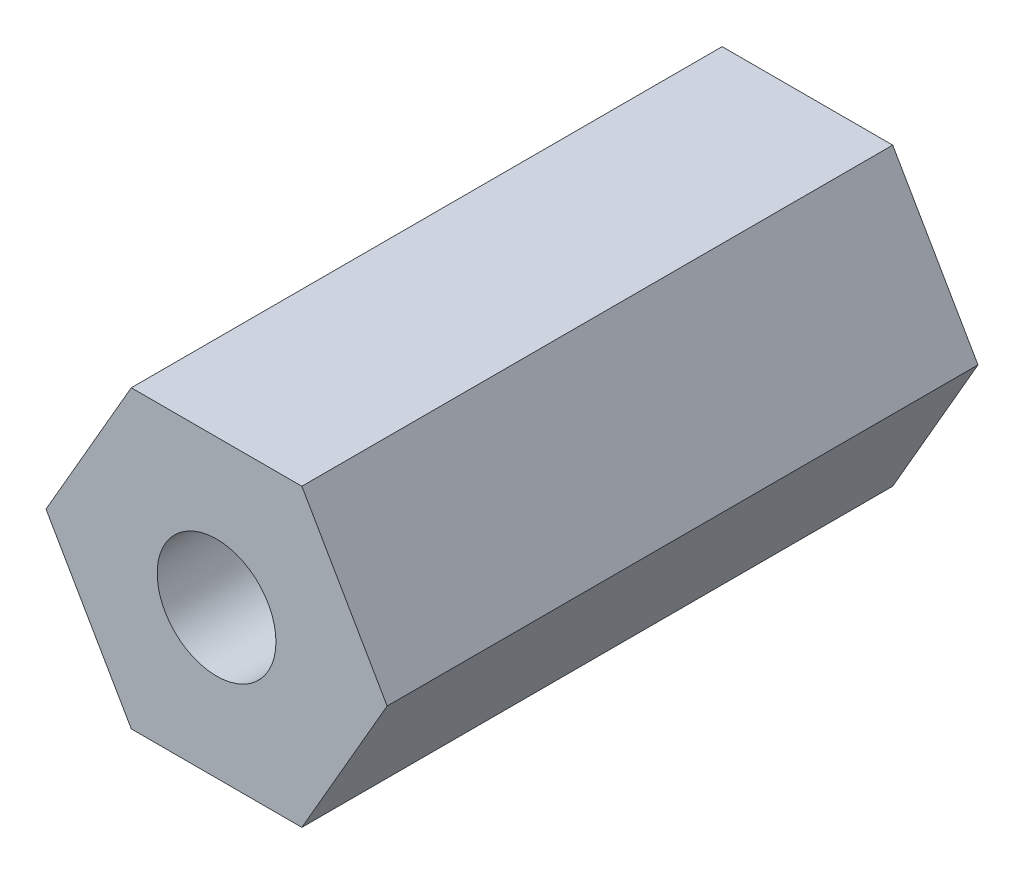
ISO-10303-21;
HEADER;
FILE_DESCRIPTION(('STEP AP214'),'2;1');
FILE_NAME('part.step','',(''),(''),'','','');
FILE_SCHEMA(('AUTOMOTIVE_DESIGN { 1 0 10303 214 1 1 1 1 }'));
ENDSEC;
DATA;
#1=APPLICATION_CONTEXT('core data for automotive mechanical design processes');
#2=APPLICATION_PROTOCOL_DEFINITION('international standard','automotive_design',2000,#1);
#3=PRODUCT_CONTEXT('',#1,'mechanical');
#4=PRODUCT('Part','Part','',(#3));
#5=PRODUCT_RELATED_PRODUCT_CATEGORY('part','',(#4));
#6=PRODUCT_DEFINITION_FORMATION('','',#4);
#7=PRODUCT_DEFINITION_CONTEXT('part definition',#1,'design');
#8=PRODUCT_DEFINITION('design','',#6,#7);
#9=PRODUCT_DEFINITION_SHAPE('','',#8);
#10=(LENGTH_UNIT() NAMED_UNIT(*) SI_UNIT(.MILLI.,.METRE.));
#11=(NAMED_UNIT(*) PLANE_ANGLE_UNIT() SI_UNIT($,.RADIAN.));
#12=(NAMED_UNIT(*) SI_UNIT($,.STERADIAN.) SOLID_ANGLE_UNIT());
#13=UNCERTAINTY_MEASURE_WITH_UNIT(LENGTH_MEASURE(1.E-05),#10,'distance_accuracy_value','');
#14=(GEOMETRIC_REPRESENTATION_CONTEXT(3) GLOBAL_UNCERTAINTY_ASSIGNED_CONTEXT((#13)) GLOBAL_UNIT_ASSIGNED_CONTEXT((#10,
#11,#12)) REPRESENTATION_CONTEXT('',''));
#15=CARTESIAN_POINT('',(0.,0.,0.));
#16=DIRECTION('',(0.,0.,1.));
#17=DIRECTION('',(1.,0.,0.));
#18=AXIS2_PLACEMENT_3D('',#15,#16,#17);
#19=CARTESIAN_POINT('',(0.,0.,25.4));
#20=DIRECTION('',(0.,0.,1.));
#21=DIRECTION('',(1.,0.,0.));
#22=AXIS2_PLACEMENT_3D('',#19,#20,#21);
#23=PLANE('',#22);
#24=DIRECTION('',(1.,0.,0.));
#25=VECTOR('',#24,1.);
#26=CARTESIAN_POINT('',(-3.66617420935412,-6.35,25.4));
#27=LINE('',#26,#25);
#28=CARTESIAN_POINT('',(-3.66617420935412,-6.35,25.4));
#29=VERTEX_POINT('',#28);
#30=CARTESIAN_POINT('',(3.66617420935413,-6.35,25.4));
#31=VERTEX_POINT('',#30);
#32=EDGE_CURVE('E135',#29,#31,#27,.T.);
#33=ORIENTED_EDGE('',*,*,#32,.T.);
#34=DIRECTION('',(0.5,0.866025403784439,0.));
#35=VECTOR('',#34,1.);
#36=CARTESIAN_POINT('',(3.66617420935413,-6.35,25.4));
#37=LINE('',#36,#35);
#38=CARTESIAN_POINT('',(7.33234841870825,0.,25.4));
#39=VERTEX_POINT('',#38);
#40=EDGE_CURVE('E93',#31,#39,#37,.T.);
#41=ORIENTED_EDGE('',*,*,#40,.T.);
#42=DIRECTION('',(-0.500000000000001,0.866025403784438,0.));
#43=VECTOR('',#42,1.);
#44=CARTESIAN_POINT('',(7.33234841870825,0.,25.4));
#45=LINE('',#44,#43);
#46=CARTESIAN_POINT('',(3.66617420935412,6.35,25.4));
#47=VERTEX_POINT('',#46);
#48=EDGE_CURVE('E106',#39,#47,#45,.T.);
#49=ORIENTED_EDGE('',*,*,#48,.T.);
#50=DIRECTION('',(-1.,0.,0.));
#51=VECTOR('',#50,1.);
#52=CARTESIAN_POINT('',(3.66617420935412,6.35,25.4));
#53=LINE('',#52,#51);
#54=CARTESIAN_POINT('',(-3.66617420935413,6.35,25.4));
#55=VERTEX_POINT('',#54);
#56=EDGE_CURVE('E100',#47,#55,#53,.T.);
#57=ORIENTED_EDGE('',*,*,#56,.T.);
#58=DIRECTION('',(-0.5,-0.866025403784439,0.));
#59=VECTOR('',#58,1.);
#60=CARTESIAN_POINT('',(-3.66617420935413,6.35,25.4));
#61=LINE('',#60,#59);
#62=CARTESIAN_POINT('',(-7.33234841870825,0.,25.4));
#63=VERTEX_POINT('',#62);
#64=EDGE_CURVE('E104',#55,#63,#61,.T.);
#65=ORIENTED_EDGE('',*,*,#64,.T.);
#66=DIRECTION('',(0.5,-0.866025403784438,0.));
#67=VECTOR('',#66,1.);
#68=CARTESIAN_POINT('',(-7.33234841870825,0.,25.4));
#69=LINE('',#68,#67);
#70=EDGE_CURVE('E56',#63,#29,#69,.T.);
#71=ORIENTED_EDGE('',*,*,#70,.T.);
#72=EDGE_LOOP('',(#33,#41,#49,#57,#65,#71));
#73=FACE_BOUND('',#72,.T.);
#74=CARTESIAN_POINT('',(0.,0.,25.4));
#75=DIRECTION('',(0.,0.,1.));
#76=DIRECTION('',(1.,0.,0.));
#77=AXIS2_PLACEMENT_3D('',#74,#75,#76);
#78=CIRCLE('',#77,2.5527);
#79=CARTESIAN_POINT('',(2.5527,0.,25.4));
#80=VERTEX_POINT('',#79);
#81=EDGE_CURVE('E128',#80,#80,#78,.T.);
#82=ORIENTED_EDGE('',*,*,#81,.F.);
#83=EDGE_LOOP('',(#82));
#84=FACE_BOUND('',#83,.T.);
#85=ADVANCED_FACE('F39',(#73,#84),#23,.T.);
#86=CARTESIAN_POINT('',(0.,0.,0.));
#87=DIRECTION('',(0.,0.,1.));
#88=DIRECTION('',(1.,0.,0.));
#89=AXIS2_PLACEMENT_3D('',#86,#87,#88);
#90=PLANE('',#89);
#91=DIRECTION('',(1.,0.,0.));
#92=VECTOR('',#91,1.);
#93=CARTESIAN_POINT('',(-3.66617420935412,-6.35,0.));
#94=LINE('',#93,#92);
#95=CARTESIAN_POINT('',(-3.66617420935412,-6.35,0.));
#96=VERTEX_POINT('',#95);
#97=CARTESIAN_POINT('',(3.66617420935413,-6.35,0.));
#98=VERTEX_POINT('',#97);
#99=EDGE_CURVE('E124',#96,#98,#94,.T.);
#100=ORIENTED_EDGE('',*,*,#99,.F.);
#101=DIRECTION('',(0.5,-0.866025403784438,0.));
#102=VECTOR('',#101,1.);
#103=CARTESIAN_POINT('',(-7.33234841870825,0.,0.));
#104=LINE('',#103,#102);
#105=CARTESIAN_POINT('',(-7.33234841870825,0.,0.));
#106=VERTEX_POINT('',#105);
#107=EDGE_CURVE('E85',#106,#96,#104,.T.);
#108=ORIENTED_EDGE('',*,*,#107,.F.);
#109=DIRECTION('',(-0.5,-0.866025403784439,0.));
#110=VECTOR('',#109,1.);
#111=CARTESIAN_POINT('',(-3.66617420935413,6.35,0.));
#112=LINE('',#111,#110);
#113=CARTESIAN_POINT('',(-3.66617420935413,6.35,0.));
#114=VERTEX_POINT('',#113);
#115=EDGE_CURVE('E79',#114,#106,#112,.T.);
#116=ORIENTED_EDGE('',*,*,#115,.F.);
#117=DIRECTION('',(-1.,0.,0.));
#118=VECTOR('',#117,1.);
#119=CARTESIAN_POINT('',(3.66617420935412,6.35,0.));
#120=LINE('',#119,#118);
#121=CARTESIAN_POINT('',(3.66617420935412,6.35,0.));
#122=VERTEX_POINT('',#121);
#123=EDGE_CURVE('E114',#122,#114,#120,.T.);
#124=ORIENTED_EDGE('',*,*,#123,.F.);
#125=DIRECTION('',(-0.500000000000001,0.866025403784438,0.));
#126=VECTOR('',#125,1.);
#127=CARTESIAN_POINT('',(7.33234841870825,0.,0.));
#128=LINE('',#127,#126);
#129=CARTESIAN_POINT('',(7.33234841870825,0.,0.));
#130=VERTEX_POINT('',#129);
#131=EDGE_CURVE('E130',#130,#122,#128,.T.);
#132=ORIENTED_EDGE('',*,*,#131,.F.);
#133=DIRECTION('',(0.5,0.866025403784439,0.));
#134=VECTOR('',#133,1.);
#135=CARTESIAN_POINT('',(3.66617420935413,-6.35,0.));
#136=LINE('',#135,#134);
#137=EDGE_CURVE('E127',#98,#130,#136,.T.);
#138=ORIENTED_EDGE('',*,*,#137,.F.);
#139=EDGE_LOOP('',(#100,#108,#116,#124,#132,#138));
#140=FACE_BOUND('',#139,.T.);
#141=CARTESIAN_POINT('',(0.,0.,0.));
#142=DIRECTION('',(0.,0.,1.));
#143=DIRECTION('',(1.,0.,0.));
#144=AXIS2_PLACEMENT_3D('',#141,#142,#143);
#145=CIRCLE('',#144,2.5527);
#146=CARTESIAN_POINT('',(2.5527,0.,0.));
#147=VERTEX_POINT('',#146);
#148=EDGE_CURVE('E228',#147,#147,#145,.T.);
#149=ORIENTED_EDGE('',*,*,#148,.T.);
#150=EDGE_LOOP('',(#149));
#151=FACE_BOUND('',#150,.T.);
#152=ADVANCED_FACE('F144',(#140,#151),#90,.F.);
#153=CARTESIAN_POINT('',(-3.66617420935412,-6.35,25.4));
#154=DIRECTION('',(0.,1.,0.));
#155=DIRECTION('',(-1.,0.,0.));
#156=AXIS2_PLACEMENT_3D('',#153,#154,#155);
#157=PLANE('',#156);
#158=ORIENTED_EDGE('',*,*,#99,.T.);
#159=DIRECTION('',(0.,0.,-1.));
#160=VECTOR('',#159,1.);
#161=CARTESIAN_POINT('',(3.66617420935413,-6.35,25.4));
#162=LINE('',#161,#160);
#163=EDGE_CURVE('E11',#31,#98,#162,.T.);
#164=ORIENTED_EDGE('',*,*,#163,.F.);
#165=ORIENTED_EDGE('',*,*,#32,.F.);
#166=DIRECTION('',(0.,0.,-1.));
#167=VECTOR('',#166,1.);
#168=CARTESIAN_POINT('',(-3.66617420935412,-6.35,25.4));
#169=LINE('',#168,#167);
#170=EDGE_CURVE('E120',#29,#96,#169,.T.);
#171=ORIENTED_EDGE('',*,*,#170,.T.);
#172=EDGE_LOOP('',(#158,#164,#165,#171));
#173=FACE_BOUND('',#172,.T.);
#174=ADVANCED_FACE('F41',(#173),#157,.F.);
#175=CARTESIAN_POINT('',(3.66617420935413,-6.35,25.4));
#176=DIRECTION('',(-0.866025403784439,0.5,0.));
#177=DIRECTION('',(-0.5,-0.866025403784439,0.));
#178=AXIS2_PLACEMENT_3D('',#175,#176,#177);
#179=PLANE('',#178);
#180=ORIENTED_EDGE('',*,*,#137,.T.);
#181=DIRECTION('',(0.,0.,-1.));
#182=VECTOR('',#181,1.);
#183=CARTESIAN_POINT('',(7.33234841870825,0.,25.4));
#184=LINE('',#183,#182);
#185=EDGE_CURVE('E48',#39,#130,#184,.T.);
#186=ORIENTED_EDGE('',*,*,#185,.F.);
#187=ORIENTED_EDGE('',*,*,#40,.F.);
#188=ORIENTED_EDGE('',*,*,#163,.T.);
#189=EDGE_LOOP('',(#180,#186,#187,#188));
#190=FACE_BOUND('',#189,.T.);
#191=ADVANCED_FACE('F169',(#190),#179,.F.);
#192=CARTESIAN_POINT('',(7.33234841870825,0.,25.4));
#193=DIRECTION('',(-0.866025403784438,-0.500000000000001,0.));
#194=DIRECTION('',(0.500000000000001,-0.866025403784438,0.));
#195=AXIS2_PLACEMENT_3D('',#192,#193,#194);
#196=PLANE('',#195);
#197=ORIENTED_EDGE('',*,*,#131,.T.);
#198=DIRECTION('',(0.,0.,-1.));
#199=VECTOR('',#198,1.);
#200=CARTESIAN_POINT('',(3.66617420935412,6.35,25.4));
#201=LINE('',#200,#199);
#202=EDGE_CURVE('E115',#47,#122,#201,.T.);
#203=ORIENTED_EDGE('',*,*,#202,.F.);
#204=ORIENTED_EDGE('',*,*,#48,.F.);
#205=ORIENTED_EDGE('',*,*,#185,.T.);
#206=EDGE_LOOP('',(#197,#203,#204,#205));
#207=FACE_BOUND('',#206,.T.);
#208=ADVANCED_FACE('F141',(#207),#196,.F.);
#209=CARTESIAN_POINT('',(3.66617420935412,6.35,25.4));
#210=DIRECTION('',(0.,-1.,0.));
#211=DIRECTION('',(1.,0.,0.));
#212=AXIS2_PLACEMENT_3D('',#209,#210,#211);
#213=PLANE('',#212);
#214=ORIENTED_EDGE('',*,*,#123,.T.);
#215=DIRECTION('',(0.,0.,-1.));
#216=VECTOR('',#215,1.);
#217=CARTESIAN_POINT('',(-3.66617420935413,6.35,25.4));
#218=LINE('',#217,#216);
#219=EDGE_CURVE('E111',#55,#114,#218,.T.);
#220=ORIENTED_EDGE('',*,*,#219,.F.);
#221=ORIENTED_EDGE('',*,*,#56,.F.);
#222=ORIENTED_EDGE('',*,*,#202,.T.);
#223=EDGE_LOOP('',(#214,#220,#221,#222));
#224=FACE_BOUND('',#223,.T.);
#225=ADVANCED_FACE('F112',(#224),#213,.F.);
#226=CARTESIAN_POINT('',(-3.66617420935413,6.35,25.4));
#227=DIRECTION('',(0.866025403784439,-0.5,0.));
#228=DIRECTION('',(0.5,0.866025403784439,0.));
#229=AXIS2_PLACEMENT_3D('',#226,#227,#228);
#230=PLANE('',#229);
#231=ORIENTED_EDGE('',*,*,#115,.T.);
#232=DIRECTION('',(0.,0.,-1.));
#233=VECTOR('',#232,1.);
#234=CARTESIAN_POINT('',(-7.33234841870825,0.,25.4));
#235=LINE('',#234,#233);
#236=EDGE_CURVE('E116',#63,#106,#235,.T.);
#237=ORIENTED_EDGE('',*,*,#236,.F.);
#238=ORIENTED_EDGE('',*,*,#64,.F.);
#239=ORIENTED_EDGE('',*,*,#219,.T.);
#240=EDGE_LOOP('',(#231,#237,#238,#239));
#241=FACE_BOUND('',#240,.T.);
#242=ADVANCED_FACE('F118',(#241),#230,.F.);
#243=CARTESIAN_POINT('',(-7.33234841870825,0.,25.4));
#244=DIRECTION('',(0.866025403784438,0.5,0.));
#245=DIRECTION('',(-0.5,0.866025403784439,0.));
#246=AXIS2_PLACEMENT_3D('',#243,#244,#245);
#247=PLANE('',#246);
#248=ORIENTED_EDGE('',*,*,#107,.T.);
#249=ORIENTED_EDGE('',*,*,#170,.F.);
#250=ORIENTED_EDGE('',*,*,#70,.F.);
#251=ORIENTED_EDGE('',*,*,#236,.T.);
#252=EDGE_LOOP('',(#248,#249,#250,#251));
#253=FACE_BOUND('',#252,.T.);
#254=ADVANCED_FACE('F149',(#253),#247,.F.);
#255=CARTESIAN_POINT('',(0.,0.,25.4));
#256=DIRECTION('',(0.,0.,-1.));
#257=DIRECTION('',(-1.,0.,0.));
#258=AXIS2_PLACEMENT_3D('',#255,#256,#257);
#259=CYLINDRICAL_SURFACE('',#258,2.5527);
#260=ORIENTED_EDGE('',*,*,#81,.T.);
#261=EDGE_LOOP('',(#260));
#262=FACE_BOUND('',#261,.T.);
#263=ORIENTED_EDGE('',*,*,#148,.F.);
#264=EDGE_LOOP('',(#263));
#265=FACE_BOUND('',#264,.T.);
#266=ADVANCED_FACE('F151',(#262,#265),#259,.F.);
#267=CLOSED_SHELL('',(#85,#152,#174,#191,#208,#225,#242,#254,#266));
#268=MANIFOLD_SOLID_BREP('B2',#267);
#269=ADVANCED_BREP_SHAPE_REPRESENTATION('',(#18,#268),#14);
#270=SHAPE_DEFINITION_REPRESENTATION(#9,#269);
ENDSEC;
END-ISO-10303-21;
